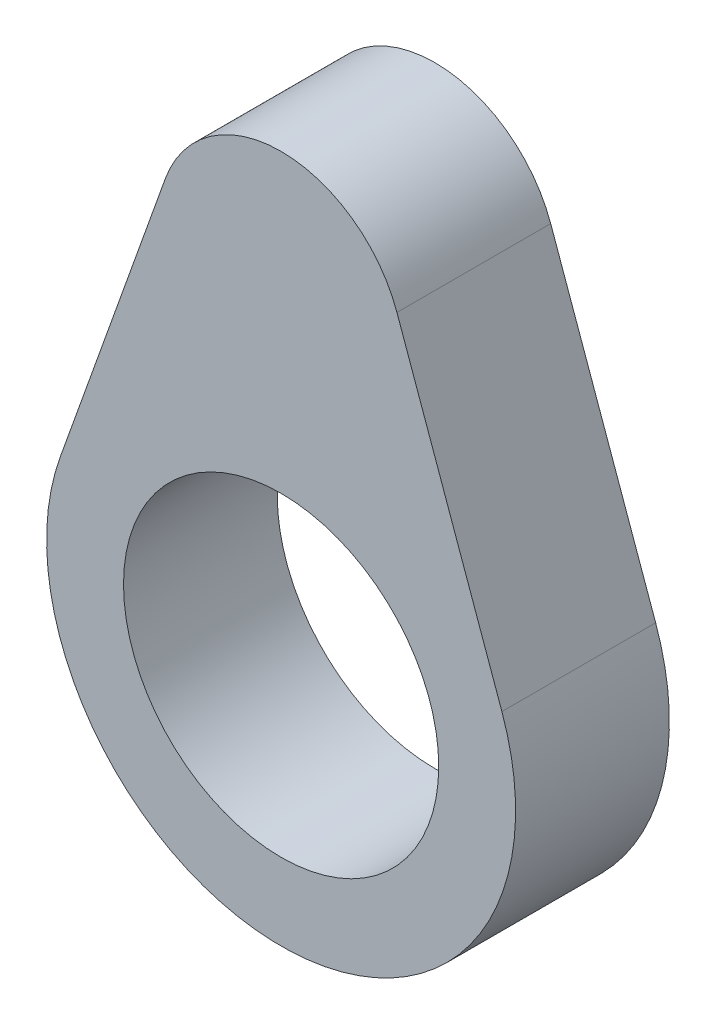
ISO-10303-21;
HEADER;
FILE_DESCRIPTION(('STEP AP214'),'2;1');
FILE_NAME('part.step','',(''),(''),'','','');
FILE_SCHEMA(('AUTOMOTIVE_DESIGN { 1 0 10303 214 1 1 1 1 }'));
ENDSEC;
DATA;
#1=APPLICATION_CONTEXT('core data for automotive mechanical design processes');
#2=APPLICATION_PROTOCOL_DEFINITION('international standard','automotive_design',2000,#1);
#3=PRODUCT_CONTEXT('',#1,'mechanical');
#4=PRODUCT('Part','Part','',(#3));
#5=PRODUCT_RELATED_PRODUCT_CATEGORY('part','',(#4));
#6=PRODUCT_DEFINITION_FORMATION('','',#4);
#7=PRODUCT_DEFINITION_CONTEXT('part definition',#1,'design');
#8=PRODUCT_DEFINITION('design','',#6,#7);
#9=PRODUCT_DEFINITION_SHAPE('','',#8);
#10=(LENGTH_UNIT() NAMED_UNIT(*) SI_UNIT(.MILLI.,.METRE.));
#11=(NAMED_UNIT(*) PLANE_ANGLE_UNIT() SI_UNIT($,.RADIAN.));
#12=(NAMED_UNIT(*) SI_UNIT($,.STERADIAN.) SOLID_ANGLE_UNIT());
#13=UNCERTAINTY_MEASURE_WITH_UNIT(LENGTH_MEASURE(1.E-05),#10,'distance_accuracy_value','');
#14=(GEOMETRIC_REPRESENTATION_CONTEXT(3) GLOBAL_UNCERTAINTY_ASSIGNED_CONTEXT((#13)) GLOBAL_UNIT_ASSIGNED_CONTEXT((#10,
#11,#12)) REPRESENTATION_CONTEXT('',''));
#15=CARTESIAN_POINT('',(0.,0.,0.));
#16=DIRECTION('',(0.,0.,1.));
#17=DIRECTION('',(1.,0.,0.));
#18=AXIS2_PLACEMENT_3D('',#15,#16,#17);
#19=CARTESIAN_POINT('',(7.17893944453459,2.56976102976273,5.));
#20=DIRECTION('',(0.941498487518401,0.337017207276665,0.));
#21=DIRECTION('',(-0.337017207276665,0.941498487518401,0.));
#22=AXIS2_PLACEMENT_3D('',#19,#20,#21);
#23=PLANE('',#22);
#24=DIRECTION('',(0.337017207276665,-0.941498487518401,0.));
#25=VECTOR('',#24,1.);
#26=CARTESIAN_POINT('',(7.17893944453459,2.56976102976273,0.));
#27=LINE('',#26,#25);
#28=CARTESIAN_POINT('',(3.76599395007361,12.1042386517908,0.));
#29=VERTEX_POINT('',#28);
#30=CARTESIAN_POINT('',(7.17893944453459,2.56976102976273,0.));
#31=VERTEX_POINT('',#30);
#32=EDGE_CURVE('E111',#29,#31,#27,.T.);
#33=ORIENTED_EDGE('',*,*,#32,.F.);
#34=DIRECTION('',(0.,0.,-1.));
#35=VECTOR('',#34,1.);
#36=CARTESIAN_POINT('',(3.76599395007361,12.1042386517908,5.));
#37=LINE('',#36,#35);
#38=CARTESIAN_POINT('',(3.76599395007361,12.1042386517908,5.));
#39=VERTEX_POINT('',#38);
#40=EDGE_CURVE('E49',#29,#39,#37,.F.);
#41=ORIENTED_EDGE('',*,*,#40,.T.);
#42=DIRECTION('',(0.337017207276665,-0.941498487518401,0.));
#43=VECTOR('',#42,1.);
#44=CARTESIAN_POINT('',(7.17893944453459,2.56976102976273,5.));
#45=LINE('',#44,#43);
#46=CARTESIAN_POINT('',(7.17893944453459,2.56976102976273,5.));
#47=VERTEX_POINT('',#46);
#48=EDGE_CURVE('E91',#39,#47,#45,.T.);
#49=ORIENTED_EDGE('',*,*,#48,.T.);
#50=DIRECTION('',(0.,0.,-1.));
#51=VECTOR('',#50,1.);
#52=CARTESIAN_POINT('',(7.17893944453459,2.56976102976273,5.));
#53=LINE('',#52,#51);
#54=EDGE_CURVE('E101',#47,#31,#53,.T.);
#55=ORIENTED_EDGE('',*,*,#54,.T.);
#56=EDGE_LOOP('',(#33,#41,#49,#55));
#57=FACE_BOUND('',#56,.T.);
#58=ADVANCED_FACE('F41',(#57),#23,.T.);
#59=CARTESIAN_POINT('',(-7.17893944453459,2.56976102976273,5.));
#60=DIRECTION('',(0.941498487518401,-0.337017207276665,0.));
#61=DIRECTION('',(0.337017207276665,0.941498487518401,0.));
#62=AXIS2_PLACEMENT_3D('',#59,#60,#61);
#63=PLANE('',#62);
#64=DIRECTION('',(-0.337017207276665,-0.941498487518401,0.));
#65=VECTOR('',#64,1.);
#66=CARTESIAN_POINT('',(-7.17893944453459,2.56976102976273,5.));
#67=LINE('',#66,#65);
#68=CARTESIAN_POINT('',(-3.76599395007361,12.1042386517908,5.));
#69=VERTEX_POINT('',#68);
#70=CARTESIAN_POINT('',(-7.17893944453459,2.56976102976273,5.));
#71=VERTEX_POINT('',#70);
#72=EDGE_CURVE('E80',#69,#71,#67,.T.);
#73=ORIENTED_EDGE('',*,*,#72,.F.);
#74=DIRECTION('',(0.,0.,-1.));
#75=VECTOR('',#74,1.);
#76=CARTESIAN_POINT('',(-3.76599395007361,12.1042386517908,0.));
#77=LINE('',#76,#75);
#78=CARTESIAN_POINT('',(-3.76599395007361,12.1042386517908,0.));
#79=VERTEX_POINT('',#78);
#80=EDGE_CURVE('E100',#69,#79,#77,.T.);
#81=ORIENTED_EDGE('',*,*,#80,.T.);
#82=DIRECTION('',(-0.337017207276665,-0.941498487518401,0.));
#83=VECTOR('',#82,1.);
#84=CARTESIAN_POINT('',(-7.17893944453459,2.56976102976273,0.));
#85=LINE('',#84,#83);
#86=CARTESIAN_POINT('',(-7.17893944453459,2.56976102976273,0.));
#87=VERTEX_POINT('',#86);
#88=EDGE_CURVE('E96',#79,#87,#85,.T.);
#89=ORIENTED_EDGE('',*,*,#88,.T.);
#90=DIRECTION('',(0.,0.,-1.));
#91=VECTOR('',#90,1.);
#92=CARTESIAN_POINT('',(-7.17893944453459,2.56976102976273,5.));
#93=LINE('',#92,#91);
#94=EDGE_CURVE('E94',#71,#87,#93,.T.);
#95=ORIENTED_EDGE('',*,*,#94,.F.);
#96=EDGE_LOOP('',(#73,#81,#89,#95));
#97=FACE_BOUND('',#96,.T.);
#98=ADVANCED_FACE('F95',(#97),#63,.F.);
#99=CARTESIAN_POINT('',(0.,0.,5.));
#100=DIRECTION('',(0.,0.,-1.));
#101=DIRECTION('',(-1.,0.,0.));
#102=AXIS2_PLACEMENT_3D('',#99,#100,#101);
#103=CYLINDRICAL_SURFACE('',#102,7.62501431463456);
#104=CARTESIAN_POINT('',(0.,0.,0.));
#105=DIRECTION('',(0.,0.,1.));
#106=DIRECTION('',(1.,0.,0.));
#107=AXIS2_PLACEMENT_3D('',#104,#105,#106);
#108=CIRCLE('',#107,7.62501431463456);
#109=EDGE_CURVE('E114',#87,#31,#108,.T.);
#110=ORIENTED_EDGE('',*,*,#109,.T.);
#111=ORIENTED_EDGE('',*,*,#54,.F.);
#112=CARTESIAN_POINT('',(0.,0.,5.));
#113=DIRECTION('',(0.,0.,1.));
#114=DIRECTION('',(1.,0.,0.));
#115=AXIS2_PLACEMENT_3D('',#112,#113,#114);
#116=CIRCLE('',#115,7.62501431463456);
#117=EDGE_CURVE('E85',#71,#47,#116,.T.);
#118=ORIENTED_EDGE('',*,*,#117,.F.);
#119=ORIENTED_EDGE('',*,*,#94,.T.);
#120=EDGE_LOOP('',(#110,#111,#118,#119));
#121=FACE_BOUND('',#120,.T.);
#122=ADVANCED_FACE('F103',(#121),#103,.T.);
#123=CARTESIAN_POINT('',(0.,0.,5.));
#124=DIRECTION('',(0.,0.,-1.));
#125=DIRECTION('',(-1.,0.,0.));
#126=AXIS2_PLACEMENT_3D('',#123,#124,#125);
#127=CYLINDRICAL_SURFACE('',#126,5.125);
#128=CARTESIAN_POINT('',(0.,0.,5.));
#129=DIRECTION('',(0.,0.,1.));
#130=DIRECTION('',(1.,0.,0.));
#131=AXIS2_PLACEMENT_3D('',#128,#129,#130);
#132=CIRCLE('',#131,5.125);
#133=CARTESIAN_POINT('',(5.125,0.,5.));
#134=VERTEX_POINT('',#133);
#135=EDGE_CURVE('E105',#134,#134,#132,.T.);
#136=ORIENTED_EDGE('',*,*,#135,.T.);
#137=EDGE_LOOP('',(#136));
#138=FACE_BOUND('',#137,.T.);
#139=CARTESIAN_POINT('',(0.,0.,0.));
#140=DIRECTION('',(0.,0.,1.));
#141=DIRECTION('',(1.,0.,0.));
#142=AXIS2_PLACEMENT_3D('',#139,#140,#141);
#143=CIRCLE('',#142,5.125);
#144=CARTESIAN_POINT('',(5.125,0.,0.));
#145=VERTEX_POINT('',#144);
#146=EDGE_CURVE('E116',#145,#145,#143,.T.);
#147=ORIENTED_EDGE('',*,*,#146,.F.);
#148=EDGE_LOOP('',(#147));
#149=FACE_BOUND('',#148,.T.);
#150=ADVANCED_FACE('F138',(#138,#149),#127,.F.);
#151=CARTESIAN_POINT('',(0.,0.,5.));
#152=DIRECTION('',(0.,0.,1.));
#153=DIRECTION('',(1.,0.,0.));
#154=AXIS2_PLACEMENT_3D('',#151,#152,#153);
#155=PLANE('',#154);
#156=ORIENTED_EDGE('',*,*,#48,.F.);
#157=CARTESIAN_POINT('',(0.,10.7561698226841,5.));
#158=DIRECTION('',(0.,0.,1.));
#159=DIRECTION('',(1.,0.,0.));
#160=AXIS2_PLACEMENT_3D('',#157,#158,#159);
#161=CIRCLE('',#160,4.);
#162=EDGE_CURVE('E11',#39,#69,#161,.T.);
#163=ORIENTED_EDGE('',*,*,#162,.T.);
#164=ORIENTED_EDGE('',*,*,#72,.T.);
#165=ORIENTED_EDGE('',*,*,#117,.T.);
#166=EDGE_LOOP('',(#156,#163,#164,#165));
#167=FACE_BOUND('',#166,.T.);
#168=ORIENTED_EDGE('',*,*,#135,.F.);
#169=EDGE_LOOP('',(#168));
#170=FACE_BOUND('',#169,.T.);
#171=ADVANCED_FACE('F82',(#167,#170),#155,.T.);
#172=CARTESIAN_POINT('',(0.,0.,0.));
#173=DIRECTION('',(0.,0.,1.));
#174=DIRECTION('',(1.,0.,0.));
#175=AXIS2_PLACEMENT_3D('',#172,#173,#174);
#176=PLANE('',#175);
#177=ORIENTED_EDGE('',*,*,#88,.F.);
#178=CARTESIAN_POINT('',(0.,10.7561698226841,0.));
#179=DIRECTION('',(0.,0.,1.));
#180=DIRECTION('',(1.,0.,0.));
#181=AXIS2_PLACEMENT_3D('',#178,#179,#180);
#182=CIRCLE('',#181,4.);
#183=EDGE_CURVE('E63',#79,#29,#182,.F.);
#184=ORIENTED_EDGE('',*,*,#183,.T.);
#185=ORIENTED_EDGE('',*,*,#32,.T.);
#186=ORIENTED_EDGE('',*,*,#109,.F.);
#187=EDGE_LOOP('',(#177,#184,#185,#186));
#188=FACE_BOUND('',#187,.T.);
#189=ORIENTED_EDGE('',*,*,#146,.T.);
#190=EDGE_LOOP('',(#189));
#191=FACE_BOUND('',#190,.T.);
#192=ADVANCED_FACE('F122',(#188,#191),#176,.F.);
#193=CARTESIAN_POINT('',(0.,10.7561698226841,5.));
#194=DIRECTION('',(0.,0.,1.));
#195=DIRECTION('',(1.,0.,0.));
#196=AXIS2_PLACEMENT_3D('',#193,#194,#195);
#197=CYLINDRICAL_SURFACE('',#196,4.);
#198=ORIENTED_EDGE('',*,*,#162,.F.);
#199=ORIENTED_EDGE('',*,*,#40,.F.);
#200=ORIENTED_EDGE('',*,*,#183,.F.);
#201=ORIENTED_EDGE('',*,*,#80,.F.);
#202=EDGE_LOOP('',(#198,#199,#200,#201));
#203=FACE_BOUND('',#202,.T.);
#204=ADVANCED_FACE('F43',(#203),#197,.T.);
#205=CLOSED_SHELL('',(#58,#98,#122,#150,#171,#192,#204));
#206=MANIFOLD_SOLID_BREP('B2',#205);
#207=ADVANCED_BREP_SHAPE_REPRESENTATION('',(#18,#206),#14);
#208=SHAPE_DEFINITION_REPRESENTATION(#9,#207);
ENDSEC;
END-ISO-10303-21;
